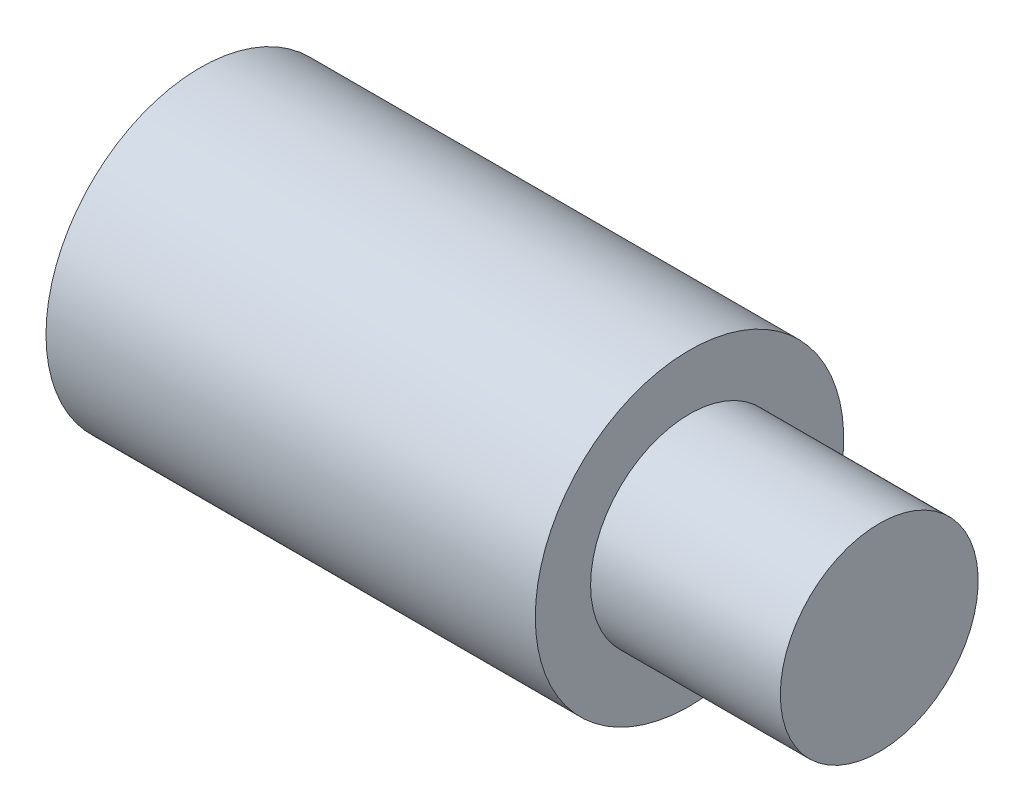
ISO-10303-21;
HEADER;
FILE_DESCRIPTION(('STEP AP214'),'2;1');
FILE_NAME('part.step','',(''),(''),'','','');
FILE_SCHEMA(('AUTOMOTIVE_DESIGN { 1 0 10303 214 1 1 1 1 }'));
ENDSEC;
DATA;
#1=APPLICATION_CONTEXT('core data for automotive mechanical design processes');
#2=APPLICATION_PROTOCOL_DEFINITION('international standard','automotive_design',2000,#1);
#3=PRODUCT_CONTEXT('',#1,'mechanical');
#4=PRODUCT('Part','Part','',(#3));
#5=PRODUCT_RELATED_PRODUCT_CATEGORY('part','',(#4));
#6=PRODUCT_DEFINITION_FORMATION('','',#4);
#7=PRODUCT_DEFINITION_CONTEXT('part definition',#1,'design');
#8=PRODUCT_DEFINITION('design','',#6,#7);
#9=PRODUCT_DEFINITION_SHAPE('','',#8);
#10=(LENGTH_UNIT() NAMED_UNIT(*) SI_UNIT(.MILLI.,.METRE.));
#11=(NAMED_UNIT(*) PLANE_ANGLE_UNIT() SI_UNIT($,.RADIAN.));
#12=(NAMED_UNIT(*) SI_UNIT($,.STERADIAN.) SOLID_ANGLE_UNIT());
#13=UNCERTAINTY_MEASURE_WITH_UNIT(LENGTH_MEASURE(1.E-05),#10,'distance_accuracy_value','');
#14=(GEOMETRIC_REPRESENTATION_CONTEXT(3) GLOBAL_UNCERTAINTY_ASSIGNED_CONTEXT((#13)) GLOBAL_UNIT_ASSIGNED_CONTEXT((#10,
#11,#12)) REPRESENTATION_CONTEXT('',''));
#15=CARTESIAN_POINT('',(0.,0.,0.));
#16=DIRECTION('',(0.,0.,1.));
#17=DIRECTION('',(1.,0.,0.));
#18=AXIS2_PLACEMENT_3D('',#15,#16,#17);
#19=CARTESIAN_POINT('',(9.5,0.,0.));
#20=DIRECTION('',(-1.,0.,0.));
#21=DIRECTION('',(0.,0.,1.));
#22=AXIS2_PLACEMENT_3D('',#19,#20,#21);
#23=PLANE('',#22);
#24=CARTESIAN_POINT('',(9.50000000000006,0.,0.));
#25=DIRECTION('',(-1.,0.,0.));
#26=DIRECTION('',(0.,0.,1.));
#27=AXIS2_PLACEMENT_3D('',#24,#25,#26);
#28=CIRCLE('',#27,4.953);
#29=CARTESIAN_POINT('',(9.50000000000006,0.,4.953));
#30=VERTEX_POINT('',#29);
#31=EDGE_CURVE('E10',#30,#30,#28,.T.);
#32=ORIENTED_EDGE('',*,*,#31,.F.);
#33=EDGE_LOOP('',(#32));
#34=FACE_BOUND('',#33,.T.);
#35=ADVANCED_FACE('F39',(#34),#23,.F.);
#36=CARTESIAN_POINT('',(-1000.,0.,0.));
#37=DIRECTION('',(-1.,0.,0.));
#38=DIRECTION('',(0.,0.,1.));
#39=AXIS2_PLACEMENT_3D('',#36,#37,#38);
#40=CYLINDRICAL_SURFACE('',#39,4.953);
#41=CARTESIAN_POINT('',(0.,0.,0.));
#42=DIRECTION('',(-1.,0.,0.));
#43=DIRECTION('',(0.,0.,1.));
#44=AXIS2_PLACEMENT_3D('',#41,#42,#43);
#45=CIRCLE('',#44,4.953);
#46=CARTESIAN_POINT('',(0.,0.,4.953));
#47=VERTEX_POINT('',#46);
#48=EDGE_CURVE('E46',#47,#47,#45,.T.);
#49=ORIENTED_EDGE('',*,*,#48,.F.);
#50=EDGE_LOOP('',(#49));
#51=FACE_BOUND('',#50,.T.);
#52=ORIENTED_EDGE('',*,*,#31,.T.);
#53=EDGE_LOOP('',(#52));
#54=FACE_BOUND('',#53,.T.);
#55=ADVANCED_FACE('F84',(#51,#54),#40,.T.);
#56=CARTESIAN_POINT('',(0.,4.953,0.));
#57=DIRECTION('',(-1.,0.,0.));
#58=DIRECTION('',(0.,0.,1.));
#59=AXIS2_PLACEMENT_3D('',#56,#57,#58);
#60=PLANE('',#59);
#61=CARTESIAN_POINT('',(0.,0.,0.));
#62=DIRECTION('',(-1.,0.,0.));
#63=DIRECTION('',(0.,0.,1.));
#64=AXIS2_PLACEMENT_3D('',#61,#62,#63);
#65=CIRCLE('',#64,7.722);
#66=CARTESIAN_POINT('',(0.,0.,7.722));
#67=VERTEX_POINT('',#66);
#68=EDGE_CURVE('E49',#67,#67,#65,.T.);
#69=ORIENTED_EDGE('',*,*,#68,.F.);
#70=EDGE_LOOP('',(#69));
#71=FACE_BOUND('',#70,.T.);
#72=ORIENTED_EDGE('',*,*,#48,.T.);
#73=EDGE_LOOP('',(#72));
#74=FACE_BOUND('',#73,.T.);
#75=ADVANCED_FACE('F76',(#71,#74),#60,.F.);
#76=CARTESIAN_POINT('',(-1000.,0.,0.));
#77=DIRECTION('',(-1.,0.,0.));
#78=DIRECTION('',(0.,0.,1.));
#79=AXIS2_PLACEMENT_3D('',#76,#77,#78);
#80=CYLINDRICAL_SURFACE('',#79,7.722);
#81=CARTESIAN_POINT('',(-24.5,0.,0.));
#82=DIRECTION('',(-1.,0.,0.));
#83=DIRECTION('',(0.,0.,1.));
#84=AXIS2_PLACEMENT_3D('',#81,#82,#83);
#85=CIRCLE('',#84,7.722);
#86=CARTESIAN_POINT('',(-24.5,0.,7.722));
#87=VERTEX_POINT('',#86);
#88=EDGE_CURVE('E54',#87,#87,#85,.T.);
#89=ORIENTED_EDGE('',*,*,#88,.F.);
#90=EDGE_LOOP('',(#89));
#91=FACE_BOUND('',#90,.T.);
#92=ORIENTED_EDGE('',*,*,#68,.T.);
#93=EDGE_LOOP('',(#92));
#94=FACE_BOUND('',#93,.T.);
#95=ADVANCED_FACE('F68',(#91,#94),#80,.T.);
#96=CARTESIAN_POINT('',(-24.5,7.722,0.));
#97=DIRECTION('',(1.,0.,0.));
#98=DIRECTION('',(0.,0.,-1.));
#99=AXIS2_PLACEMENT_3D('',#96,#97,#98);
#100=PLANE('',#99);
#101=CARTESIAN_POINT('',(-24.5,0.,0.));
#102=DIRECTION('',(1.,0.,0.));
#103=DIRECTION('',(0.,0.,-1.));
#104=AXIS2_PLACEMENT_3D('',#101,#102,#103);
#105=CIRCLE('',#104,3.175);
#106=CARTESIAN_POINT('',(-24.5,0.,-3.175));
#107=VERTEX_POINT('',#106);
#108=EDGE_CURVE('E45',#107,#107,#105,.F.);
#109=ORIENTED_EDGE('',*,*,#108,.F.);
#110=EDGE_LOOP('',(#109));
#111=FACE_BOUND('',#110,.T.);
#112=ORIENTED_EDGE('',*,*,#88,.T.);
#113=EDGE_LOOP('',(#112));
#114=FACE_BOUND('',#113,.T.);
#115=ADVANCED_FACE('F69',(#111,#114),#100,.F.);
#116=CARTESIAN_POINT('',(-1000.,0.,0.));
#117=DIRECTION('',(-1.,0.,0.));
#118=DIRECTION('',(0.,0.,1.));
#119=AXIS2_PLACEMENT_3D('',#116,#117,#118);
#120=CYLINDRICAL_SURFACE('',#119,3.175);
#121=CARTESIAN_POINT('',(-9.29999999999998,0.,0.));
#122=DIRECTION('',(-1.,0.,0.));
#123=DIRECTION('',(0.,0.,1.));
#124=AXIS2_PLACEMENT_3D('',#121,#122,#123);
#125=CIRCLE('',#124,3.175);
#126=CARTESIAN_POINT('',(-9.29999999999998,0.,3.175));
#127=VERTEX_POINT('',#126);
#128=EDGE_CURVE('E59',#127,#127,#125,.T.);
#129=ORIENTED_EDGE('',*,*,#128,.F.);
#130=EDGE_LOOP('',(#129));
#131=FACE_BOUND('',#130,.T.);
#132=ORIENTED_EDGE('',*,*,#108,.T.);
#133=EDGE_LOOP('',(#132));
#134=FACE_BOUND('',#133,.T.);
#135=ADVANCED_FACE('F64',(#131,#134),#120,.F.);
#136=CARTESIAN_POINT('',(-9.3,3.175,0.));
#137=DIRECTION('',(-1.,0.,0.));
#138=DIRECTION('',(0.,0.,1.));
#139=AXIS2_PLACEMENT_3D('',#136,#137,#138);
#140=PLANE('',#139);
#141=ORIENTED_EDGE('',*,*,#128,.T.);
#142=EDGE_LOOP('',(#141));
#143=FACE_BOUND('',#142,.T.);
#144=ADVANCED_FACE('F94',(#143),#140,.T.);
#145=CLOSED_SHELL('',(#35,#55,#75,#95,#115,#135,#144));
#146=MANIFOLD_SOLID_BREP('B2',#145);
#147=ADVANCED_BREP_SHAPE_REPRESENTATION('',(#18,#146),#14);
#148=SHAPE_DEFINITION_REPRESENTATION(#9,#147);
ENDSEC;
END-ISO-10303-21;
